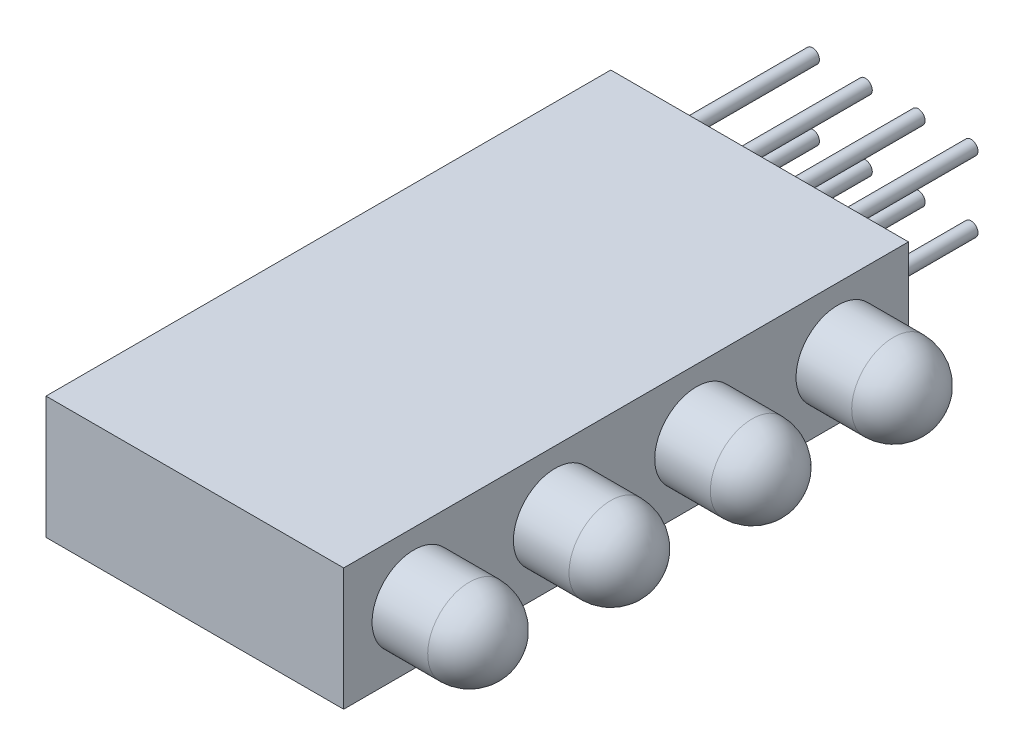
ISO-10303-21;
HEADER;
FILE_DESCRIPTION(('STEP AP214'),'2;1');
FILE_NAME('part.step','',(''),(''),'','','');
FILE_SCHEMA(('AUTOMOTIVE_DESIGN { 1 0 10303 214 1 1 1 1 }'));
ENDSEC;
DATA;
#1=APPLICATION_CONTEXT('core data for automotive mechanical design processes');
#2=APPLICATION_PROTOCOL_DEFINITION('international standard','automotive_design',2000,#1);
#3=PRODUCT_CONTEXT('',#1,'mechanical');
#4=PRODUCT('Part','Part','',(#3));
#5=PRODUCT_RELATED_PRODUCT_CATEGORY('part','',(#4));
#6=PRODUCT_DEFINITION_FORMATION('','',#4);
#7=PRODUCT_DEFINITION_CONTEXT('part definition',#1,'design');
#8=PRODUCT_DEFINITION('design','',#6,#7);
#9=PRODUCT_DEFINITION_SHAPE('','',#8);
#10=(LENGTH_UNIT() NAMED_UNIT(*) SI_UNIT(.MILLI.,.METRE.));
#11=(NAMED_UNIT(*) PLANE_ANGLE_UNIT() SI_UNIT($,.RADIAN.));
#12=(NAMED_UNIT(*) SI_UNIT($,.STERADIAN.) SOLID_ANGLE_UNIT());
#13=UNCERTAINTY_MEASURE_WITH_UNIT(LENGTH_MEASURE(1.E-05),#10,'distance_accuracy_value','');
#14=(GEOMETRIC_REPRESENTATION_CONTEXT(3) GLOBAL_UNCERTAINTY_ASSIGNED_CONTEXT((#13)) GLOBAL_UNIT_ASSIGNED_CONTEXT((#10,
#11,#12)) REPRESENTATION_CONTEXT('',''));
#15=CARTESIAN_POINT('',(0.,0.,0.));
#16=DIRECTION('',(0.,0.,1.));
#17=DIRECTION('',(1.,0.,0.));
#18=AXIS2_PLACEMENT_3D('',#15,#16,#17);
#19=CARTESIAN_POINT('',(5.35,2.2,20.3));
#20=DIRECTION('',(-1.,0.,0.));
#21=DIRECTION('',(0.,-1.,0.));
#22=AXIS2_PLACEMENT_3D('',#19,#20,#21);
#23=PLANE('',#22);
#24=CARTESIAN_POINT('',(5.35,0.,12.7));
#25=DIRECTION('',(-1.,0.,0.));
#26=DIRECTION('',(0.,-1.,0.));
#27=AXIS2_PLACEMENT_3D('',#24,#25,#26);
#28=CIRCLE('',#27,1.5);
#29=CARTESIAN_POINT('',(5.35,-1.50000000000007,12.7));
#30=VERTEX_POINT('',#29);
#31=EDGE_CURVE('E143',#30,#30,#28,.F.);
#32=ORIENTED_EDGE('',*,*,#31,.F.);
#33=EDGE_LOOP('',(#32));
#34=FACE_BOUND('',#33,.T.);
#35=CARTESIAN_POINT('',(5.35,0.,2.54));
#36=DIRECTION('',(-1.,0.,0.));
#37=DIRECTION('',(0.,-1.,0.));
#38=AXIS2_PLACEMENT_3D('',#35,#36,#37);
#39=CIRCLE('',#38,1.5);
#40=CARTESIAN_POINT('',(5.35,-1.5,2.54));
#41=VERTEX_POINT('',#40);
#42=EDGE_CURVE('E137',#41,#41,#39,.F.);
#43=ORIENTED_EDGE('',*,*,#42,.F.);
#44=EDGE_LOOP('',(#43));
#45=FACE_BOUND('',#44,.T.);
#46=DIRECTION('',(0.,1.,0.));
#47=VECTOR('',#46,1.);
#48=CARTESIAN_POINT('',(5.35,2.2,0.));
#49=LINE('',#48,#47);
#50=CARTESIAN_POINT('',(5.35,-2.2,0.));
#51=VERTEX_POINT('',#50);
#52=CARTESIAN_POINT('',(5.35,2.2,0.));
#53=VERTEX_POINT('',#52);
#54=EDGE_CURVE('E69',#51,#53,#49,.T.);
#55=ORIENTED_EDGE('',*,*,#54,.T.);
#56=DIRECTION('',(0.,0.,-1.));
#57=VECTOR('',#56,1.);
#58=CARTESIAN_POINT('',(5.35,2.2,20.3));
#59=LINE('',#58,#57);
#60=CARTESIAN_POINT('',(5.35,2.2,20.3));
#61=VERTEX_POINT('',#60);
#62=EDGE_CURVE('E95',#61,#53,#59,.T.);
#63=ORIENTED_EDGE('',*,*,#62,.F.);
#64=DIRECTION('',(0.,1.,0.));
#65=VECTOR('',#64,1.);
#66=CARTESIAN_POINT('',(5.35,2.2,20.3));
#67=LINE('',#66,#65);
#68=CARTESIAN_POINT('',(5.35,-2.2,20.3));
#69=VERTEX_POINT('',#68);
#70=EDGE_CURVE('E86',#69,#61,#67,.T.);
#71=ORIENTED_EDGE('',*,*,#70,.F.);
#72=DIRECTION('',(0.,0.,-1.));
#73=VECTOR('',#72,1.);
#74=CARTESIAN_POINT('',(5.35,-2.2,20.3));
#75=LINE('',#74,#73);
#76=EDGE_CURVE('E91',#69,#51,#75,.T.);
#77=ORIENTED_EDGE('',*,*,#76,.T.);
#78=EDGE_LOOP('',(#55,#63,#71,#77));
#79=FACE_BOUND('',#78,.T.);
#80=CARTESIAN_POINT('',(5.35,0.,7.62));
#81=DIRECTION('',(-1.,0.,0.));
#82=DIRECTION('',(0.,-1.,0.));
#83=AXIS2_PLACEMENT_3D('',#80,#81,#82);
#84=CIRCLE('',#83,1.5);
#85=CARTESIAN_POINT('',(5.35,-1.50000000000004,7.62));
#86=VERTEX_POINT('',#85);
#87=EDGE_CURVE('E140',#86,#86,#84,.F.);
#88=ORIENTED_EDGE('',*,*,#87,.F.);
#89=EDGE_LOOP('',(#88));
#90=FACE_BOUND('',#89,.T.);
#91=CARTESIAN_POINT('',(5.35,-1.08413626077967E-13,17.78));
#92=DIRECTION('',(-1.,0.,0.));
#93=DIRECTION('',(0.,-1.,0.));
#94=AXIS2_PLACEMENT_3D('',#91,#92,#93);
#95=CIRCLE('',#94,1.5);
#96=CARTESIAN_POINT('',(5.35,-1.50000000000011,17.78));
#97=VERTEX_POINT('',#96);
#98=EDGE_CURVE('E146',#97,#97,#95,.F.);
#99=ORIENTED_EDGE('',*,*,#98,.F.);
#100=EDGE_LOOP('',(#99));
#101=FACE_BOUND('',#100,.T.);
#102=ADVANCED_FACE('F35',(#34,#45,#79,#90,#101),#23,.F.);
#103=CARTESIAN_POINT('',(0.,0.,0.));
#104=DIRECTION('',(0.,0.,1.));
#105=DIRECTION('',(1.,0.,0.));
#106=AXIS2_PLACEMENT_3D('',#103,#104,#105);
#107=PLANE('',#106);
#108=CARTESIAN_POINT('',(0.699999999999999,-1.27,0.));
#109=DIRECTION('',(0.,0.,1.));
#110=DIRECTION('',(1.,0.,0.));
#111=AXIS2_PLACEMENT_3D('',#108,#109,#110);
#112=CIRCLE('',#111,0.25);
#113=CARTESIAN_POINT('',(0.95,-1.27,0.));
#114=VERTEX_POINT('',#113);
#115=EDGE_CURVE('E131',#114,#114,#112,.F.);
#116=ORIENTED_EDGE('',*,*,#115,.F.);
#117=EDGE_LOOP('',(#116));
#118=FACE_BOUND('',#117,.T.);
#119=CARTESIAN_POINT('',(-3.1,-1.27,0.));
#120=DIRECTION('',(0.,0.,1.));
#121=DIRECTION('',(1.,0.,0.));
#122=AXIS2_PLACEMENT_3D('',#119,#120,#121);
#123=CIRCLE('',#122,0.25);
#124=CARTESIAN_POINT('',(-2.85,-1.27,0.));
#125=VERTEX_POINT('',#124);
#126=EDGE_CURVE('E125',#125,#125,#123,.F.);
#127=ORIENTED_EDGE('',*,*,#126,.F.);
#128=EDGE_LOOP('',(#127));
#129=FACE_BOUND('',#128,.T.);
#130=CARTESIAN_POINT('',(-1.2,1.27,0.));
#131=DIRECTION('',(0.,0.,1.));
#132=DIRECTION('',(1.,0.,0.));
#133=AXIS2_PLACEMENT_3D('',#130,#131,#132);
#134=CIRCLE('',#133,0.25);
#135=CARTESIAN_POINT('',(-0.950000000000001,1.27,0.));
#136=VERTEX_POINT('',#135);
#137=EDGE_CURVE('E119',#136,#136,#134,.F.);
#138=ORIENTED_EDGE('',*,*,#137,.F.);
#139=EDGE_LOOP('',(#138));
#140=FACE_BOUND('',#139,.T.);
#141=CARTESIAN_POINT('',(2.6,1.27,0.));
#142=DIRECTION('',(0.,0.,1.));
#143=DIRECTION('',(1.,0.,0.));
#144=AXIS2_PLACEMENT_3D('',#141,#142,#143);
#145=CIRCLE('',#144,0.25);
#146=CARTESIAN_POINT('',(2.85,1.27,0.));
#147=VERTEX_POINT('',#146);
#148=EDGE_CURVE('E113',#147,#147,#145,.F.);
#149=ORIENTED_EDGE('',*,*,#148,.F.);
#150=EDGE_LOOP('',(#149));
#151=FACE_BOUND('',#150,.T.);
#152=DIRECTION('',(0.,-1.,0.));
#153=VECTOR('',#152,1.);
#154=CARTESIAN_POINT('',(-5.35,2.2,0.));
#155=LINE('',#154,#153);
#156=CARTESIAN_POINT('',(-5.35,2.2,0.));
#157=VERTEX_POINT('',#156);
#158=CARTESIAN_POINT('',(-5.35,-2.2,0.));
#159=VERTEX_POINT('',#158);
#160=EDGE_CURVE('E103',#157,#159,#155,.T.);
#161=ORIENTED_EDGE('',*,*,#160,.F.);
#162=DIRECTION('',(-1.,0.,0.));
#163=VECTOR('',#162,1.);
#164=CARTESIAN_POINT('',(-5.35,2.2,0.));
#165=LINE('',#164,#163);
#166=EDGE_CURVE('E75',#53,#157,#165,.T.);
#167=ORIENTED_EDGE('',*,*,#166,.F.);
#168=ORIENTED_EDGE('',*,*,#54,.F.);
#169=DIRECTION('',(1.,0.,0.));
#170=VECTOR('',#169,1.);
#171=CARTESIAN_POINT('',(-5.35,-2.2,0.));
#172=LINE('',#171,#170);
#173=EDGE_CURVE('E93',#159,#51,#172,.T.);
#174=ORIENTED_EDGE('',*,*,#173,.F.);
#175=EDGE_LOOP('',(#161,#167,#168,#174));
#176=FACE_BOUND('',#175,.T.);
#177=CARTESIAN_POINT('',(0.699999999999999,1.27,0.));
#178=DIRECTION('',(0.,0.,1.));
#179=DIRECTION('',(1.,0.,0.));
#180=AXIS2_PLACEMENT_3D('',#177,#178,#179);
#181=CIRCLE('',#180,0.25);
#182=CARTESIAN_POINT('',(0.95,1.27,0.));
#183=VERTEX_POINT('',#182);
#184=EDGE_CURVE('E116',#183,#183,#181,.F.);
#185=ORIENTED_EDGE('',*,*,#184,.F.);
#186=EDGE_LOOP('',(#185));
#187=FACE_BOUND('',#186,.T.);
#188=CARTESIAN_POINT('',(-3.1,1.27,0.));
#189=DIRECTION('',(0.,0.,1.));
#190=DIRECTION('',(1.,0.,0.));
#191=AXIS2_PLACEMENT_3D('',#188,#189,#190);
#192=CIRCLE('',#191,0.25);
#193=CARTESIAN_POINT('',(-2.85,1.27,0.));
#194=VERTEX_POINT('',#193);
#195=EDGE_CURVE('E122',#194,#194,#192,.F.);
#196=ORIENTED_EDGE('',*,*,#195,.F.);
#197=EDGE_LOOP('',(#196));
#198=FACE_BOUND('',#197,.T.);
#199=CARTESIAN_POINT('',(-1.2,-1.27,0.));
#200=DIRECTION('',(0.,0.,1.));
#201=DIRECTION('',(1.,0.,0.));
#202=AXIS2_PLACEMENT_3D('',#199,#200,#201);
#203=CIRCLE('',#202,0.25);
#204=CARTESIAN_POINT('',(-0.950000000000001,-1.27,0.));
#205=VERTEX_POINT('',#204);
#206=EDGE_CURVE('E128',#205,#205,#203,.F.);
#207=ORIENTED_EDGE('',*,*,#206,.F.);
#208=EDGE_LOOP('',(#207));
#209=FACE_BOUND('',#208,.T.);
#210=CARTESIAN_POINT('',(2.6,-1.27,0.));
#211=DIRECTION('',(0.,0.,1.));
#212=DIRECTION('',(1.,0.,0.));
#213=AXIS2_PLACEMENT_3D('',#210,#211,#212);
#214=CIRCLE('',#213,0.25);
#215=CARTESIAN_POINT('',(2.85,-1.27,0.));
#216=VERTEX_POINT('',#215);
#217=EDGE_CURVE('E134',#216,#216,#214,.F.);
#218=ORIENTED_EDGE('',*,*,#217,.F.);
#219=EDGE_LOOP('',(#218));
#220=FACE_BOUND('',#219,.T.);
#221=ADVANCED_FACE('F172',(#118,#129,#140,#151,#176,#187,#198,#209,#220),#107,.F.);
#222=CARTESIAN_POINT('',(-5.35,2.2,20.3));
#223=DIRECTION('',(1.,0.,0.));
#224=DIRECTION('',(0.,1.,0.));
#225=AXIS2_PLACEMENT_3D('',#222,#223,#224);
#226=PLANE('',#225);
#227=ORIENTED_EDGE('',*,*,#160,.T.);
#228=DIRECTION('',(0.,0.,-1.));
#229=VECTOR('',#228,1.);
#230=CARTESIAN_POINT('',(-5.35,-2.2,20.3));
#231=LINE('',#230,#229);
#232=CARTESIAN_POINT('',(-5.35,-2.2,20.3));
#233=VERTEX_POINT('',#232);
#234=EDGE_CURVE('E94',#233,#159,#231,.T.);
#235=ORIENTED_EDGE('',*,*,#234,.F.);
#236=DIRECTION('',(0.,-1.,0.));
#237=VECTOR('',#236,1.);
#238=CARTESIAN_POINT('',(-5.35,2.2,20.3));
#239=LINE('',#238,#237);
#240=CARTESIAN_POINT('',(-5.35,2.2,20.3));
#241=VERTEX_POINT('',#240);
#242=EDGE_CURVE('E88',#241,#233,#239,.T.);
#243=ORIENTED_EDGE('',*,*,#242,.F.);
#244=DIRECTION('',(0.,0.,-1.));
#245=VECTOR('',#244,1.);
#246=CARTESIAN_POINT('',(-5.35,2.2,20.3));
#247=LINE('',#246,#245);
#248=EDGE_CURVE('E99',#241,#157,#247,.T.);
#249=ORIENTED_EDGE('',*,*,#248,.T.);
#250=EDGE_LOOP('',(#227,#235,#243,#249));
#251=FACE_BOUND('',#250,.T.);
#252=ADVANCED_FACE('F178',(#251),#226,.F.);
#253=CARTESIAN_POINT('',(-5.35,-2.2,20.3));
#254=DIRECTION('',(0.,1.,0.));
#255=DIRECTION('',(0.,0.,1.));
#256=AXIS2_PLACEMENT_3D('',#253,#254,#255);
#257=PLANE('',#256);
#258=ORIENTED_EDGE('',*,*,#173,.T.);
#259=ORIENTED_EDGE('',*,*,#76,.F.);
#260=DIRECTION('',(1.,0.,0.));
#261=VECTOR('',#260,1.);
#262=CARTESIAN_POINT('',(-5.35,-2.2,20.3));
#263=LINE('',#262,#261);
#264=EDGE_CURVE('E83',#233,#69,#263,.T.);
#265=ORIENTED_EDGE('',*,*,#264,.F.);
#266=ORIENTED_EDGE('',*,*,#234,.T.);
#267=EDGE_LOOP('',(#258,#259,#265,#266));
#268=FACE_BOUND('',#267,.T.);
#269=ADVANCED_FACE('F92',(#268),#257,.F.);
#270=CARTESIAN_POINT('',(-5.35,2.2,20.3));
#271=DIRECTION('',(0.,-1.,0.));
#272=DIRECTION('',(1.,0.,0.));
#273=AXIS2_PLACEMENT_3D('',#270,#271,#272);
#274=PLANE('',#273);
#275=ORIENTED_EDGE('',*,*,#166,.T.);
#276=ORIENTED_EDGE('',*,*,#248,.F.);
#277=DIRECTION('',(-1.,0.,0.));
#278=VECTOR('',#277,1.);
#279=CARTESIAN_POINT('',(-5.35,2.2,20.3));
#280=LINE('',#279,#278);
#281=EDGE_CURVE('E52',#61,#241,#280,.T.);
#282=ORIENTED_EDGE('',*,*,#281,.F.);
#283=ORIENTED_EDGE('',*,*,#62,.T.);
#284=EDGE_LOOP('',(#275,#276,#282,#283));
#285=FACE_BOUND('',#284,.T.);
#286=ADVANCED_FACE('F185',(#285),#274,.F.);
#287=CARTESIAN_POINT('',(0.,0.,20.3));
#288=DIRECTION('',(0.,0.,1.));
#289=DIRECTION('',(1.,0.,0.));
#290=AXIS2_PLACEMENT_3D('',#287,#288,#289);
#291=PLANE('',#290);
#292=ORIENTED_EDGE('',*,*,#242,.T.);
#293=ORIENTED_EDGE('',*,*,#264,.T.);
#294=ORIENTED_EDGE('',*,*,#70,.T.);
#295=ORIENTED_EDGE('',*,*,#281,.T.);
#296=EDGE_LOOP('',(#292,#293,#294,#295));
#297=FACE_BOUND('',#296,.T.);
#298=ADVANCED_FACE('F84',(#297),#291,.T.);
#299=CARTESIAN_POINT('',(2.6,1.27,-5.));
#300=DIRECTION('',(0.,0.,1.));
#301=DIRECTION('',(1.,0.,0.));
#302=AXIS2_PLACEMENT_3D('',#299,#300,#301);
#303=CYLINDRICAL_SURFACE('',#302,0.25);
#304=CARTESIAN_POINT('',(2.6,1.27,-5.));
#305=DIRECTION('',(0.,0.,-1.));
#306=DIRECTION('',(-1.,0.,0.));
#307=AXIS2_PLACEMENT_3D('',#304,#305,#306);
#308=CIRCLE('',#307,0.25);
#309=CARTESIAN_POINT('',(2.35,1.27,-5.));
#310=VERTEX_POINT('',#309);
#311=EDGE_CURVE('E106',#310,#310,#308,.T.);
#312=ORIENTED_EDGE('',*,*,#311,.F.);
#313=EDGE_LOOP('',(#312));
#314=FACE_BOUND('',#313,.T.);
#315=ORIENTED_EDGE('',*,*,#148,.T.);
#316=EDGE_LOOP('',(#315));
#317=FACE_BOUND('',#316,.T.);
#318=ADVANCED_FACE('F273',(#314,#317),#303,.T.);
#319=CARTESIAN_POINT('',(2.6,1.27,-5.));
#320=DIRECTION('',(0.,0.,-1.));
#321=DIRECTION('',(-1.,0.,0.));
#322=AXIS2_PLACEMENT_3D('',#319,#320,#321);
#323=PLANE('',#322);
#324=ORIENTED_EDGE('',*,*,#311,.T.);
#325=EDGE_LOOP('',(#324));
#326=FACE_BOUND('',#325,.T.);
#327=ADVANCED_FACE('F269',(#326),#323,.T.);
#328=CARTESIAN_POINT('',(0.699999999999999,1.27,-5.));
#329=DIRECTION('',(0.,0.,1.));
#330=DIRECTION('',(1.,0.,0.));
#331=AXIS2_PLACEMENT_3D('',#328,#329,#330);
#332=CYLINDRICAL_SURFACE('',#331,0.25);
#333=CARTESIAN_POINT('',(0.699999999999999,1.27,-5.));
#334=DIRECTION('',(0.,0.,-1.));
#335=DIRECTION('',(-1.,0.,0.));
#336=AXIS2_PLACEMENT_3D('',#333,#334,#335);
#337=CIRCLE('',#336,0.25);
#338=CARTESIAN_POINT('',(0.449999999999999,1.27,-5.));
#339=VERTEX_POINT('',#338);
#340=EDGE_CURVE('E474',#339,#339,#337,.T.);
#341=ORIENTED_EDGE('',*,*,#340,.F.);
#342=EDGE_LOOP('',(#341));
#343=FACE_BOUND('',#342,.T.);
#344=ORIENTED_EDGE('',*,*,#184,.T.);
#345=EDGE_LOOP('',(#344));
#346=FACE_BOUND('',#345,.T.);
#347=ADVANCED_FACE('F265',(#343,#346),#332,.T.);
#348=CARTESIAN_POINT('',(0.699999999999999,1.27,-5.));
#349=DIRECTION('',(0.,0.,-1.));
#350=DIRECTION('',(-1.,0.,0.));
#351=AXIS2_PLACEMENT_3D('',#348,#349,#350);
#352=PLANE('',#351);
#353=ORIENTED_EDGE('',*,*,#340,.T.);
#354=EDGE_LOOP('',(#353));
#355=FACE_BOUND('',#354,.T.);
#356=ADVANCED_FACE('F261',(#355),#352,.T.);
#357=CARTESIAN_POINT('',(-1.2,1.27,-5.));
#358=DIRECTION('',(0.,0.,1.));
#359=DIRECTION('',(1.,0.,0.));
#360=AXIS2_PLACEMENT_3D('',#357,#358,#359);
#361=CYLINDRICAL_SURFACE('',#360,0.25);
#362=CARTESIAN_POINT('',(-1.2,1.27,-5.));
#363=DIRECTION('',(0.,0.,-1.));
#364=DIRECTION('',(-1.,0.,0.));
#365=AXIS2_PLACEMENT_3D('',#362,#363,#364);
#366=CIRCLE('',#365,0.25);
#367=CARTESIAN_POINT('',(-1.45,1.27,-5.));
#368=VERTEX_POINT('',#367);
#369=EDGE_CURVE('E477',#368,#368,#366,.T.);
#370=ORIENTED_EDGE('',*,*,#369,.F.);
#371=EDGE_LOOP('',(#370));
#372=FACE_BOUND('',#371,.T.);
#373=ORIENTED_EDGE('',*,*,#137,.T.);
#374=EDGE_LOOP('',(#373));
#375=FACE_BOUND('',#374,.T.);
#376=ADVANCED_FACE('F257',(#372,#375),#361,.T.);
#377=CARTESIAN_POINT('',(-1.2,1.27,-5.));
#378=DIRECTION('',(0.,0.,-1.));
#379=DIRECTION('',(-1.,0.,0.));
#380=AXIS2_PLACEMENT_3D('',#377,#378,#379);
#381=PLANE('',#380);
#382=ORIENTED_EDGE('',*,*,#369,.T.);
#383=EDGE_LOOP('',(#382));
#384=FACE_BOUND('',#383,.T.);
#385=ADVANCED_FACE('F253',(#384),#381,.T.);
#386=CARTESIAN_POINT('',(-3.1,1.27,-5.));
#387=DIRECTION('',(0.,0.,1.));
#388=DIRECTION('',(1.,0.,0.));
#389=AXIS2_PLACEMENT_3D('',#386,#387,#388);
#390=CYLINDRICAL_SURFACE('',#389,0.25);
#391=CARTESIAN_POINT('',(-3.1,1.27,-5.));
#392=DIRECTION('',(0.,0.,-1.));
#393=DIRECTION('',(-1.,0.,0.));
#394=AXIS2_PLACEMENT_3D('',#391,#392,#393);
#395=CIRCLE('',#394,0.25);
#396=CARTESIAN_POINT('',(-3.35,1.27,-5.));
#397=VERTEX_POINT('',#396);
#398=EDGE_CURVE('E480',#397,#397,#395,.T.);
#399=ORIENTED_EDGE('',*,*,#398,.F.);
#400=EDGE_LOOP('',(#399));
#401=FACE_BOUND('',#400,.T.);
#402=ORIENTED_EDGE('',*,*,#195,.T.);
#403=EDGE_LOOP('',(#402));
#404=FACE_BOUND('',#403,.T.);
#405=ADVANCED_FACE('F249',(#401,#404),#390,.T.);
#406=CARTESIAN_POINT('',(-3.1,1.27,-5.));
#407=DIRECTION('',(0.,0.,-1.));
#408=DIRECTION('',(-1.,0.,0.));
#409=AXIS2_PLACEMENT_3D('',#406,#407,#408);
#410=PLANE('',#409);
#411=ORIENTED_EDGE('',*,*,#398,.T.);
#412=EDGE_LOOP('',(#411));
#413=FACE_BOUND('',#412,.T.);
#414=ADVANCED_FACE('F245',(#413),#410,.T.);
#415=CARTESIAN_POINT('',(-3.1,-1.27,-5.));
#416=DIRECTION('',(0.,0.,1.));
#417=DIRECTION('',(1.,0.,0.));
#418=AXIS2_PLACEMENT_3D('',#415,#416,#417);
#419=CYLINDRICAL_SURFACE('',#418,0.25);
#420=CARTESIAN_POINT('',(-3.1,-1.27,-5.));
#421=DIRECTION('',(0.,0.,-1.));
#422=DIRECTION('',(1.,0.,0.));
#423=AXIS2_PLACEMENT_3D('',#420,#421,#422);
#424=CIRCLE('',#423,0.25);
#425=CARTESIAN_POINT('',(-2.85,-1.27,-5.));
#426=VERTEX_POINT('',#425);
#427=EDGE_CURVE('E483',#426,#426,#424,.T.);
#428=ORIENTED_EDGE('',*,*,#427,.F.);
#429=EDGE_LOOP('',(#428));
#430=FACE_BOUND('',#429,.T.);
#431=ORIENTED_EDGE('',*,*,#126,.T.);
#432=EDGE_LOOP('',(#431));
#433=FACE_BOUND('',#432,.T.);
#434=ADVANCED_FACE('F241',(#430,#433),#419,.T.);
#435=CARTESIAN_POINT('',(-3.1,-1.27,-5.));
#436=DIRECTION('',(0.,0.,1.));
#437=DIRECTION('',(1.,0.,0.));
#438=AXIS2_PLACEMENT_3D('',#435,#436,#437);
#439=PLANE('',#438);
#440=ORIENTED_EDGE('',*,*,#427,.T.);
#441=EDGE_LOOP('',(#440));
#442=FACE_BOUND('',#441,.T.);
#443=ADVANCED_FACE('F237',(#442),#439,.F.);
#444=CARTESIAN_POINT('',(-1.2,-1.27,-5.));
#445=DIRECTION('',(0.,0.,1.));
#446=DIRECTION('',(1.,0.,0.));
#447=AXIS2_PLACEMENT_3D('',#444,#445,#446);
#448=CYLINDRICAL_SURFACE('',#447,0.25);
#449=CARTESIAN_POINT('',(-1.2,-1.27,-5.));
#450=DIRECTION('',(0.,0.,-1.));
#451=DIRECTION('',(1.,0.,0.));
#452=AXIS2_PLACEMENT_3D('',#449,#450,#451);
#453=CIRCLE('',#452,0.25);
#454=CARTESIAN_POINT('',(-0.950000000000001,-1.27,-5.));
#455=VERTEX_POINT('',#454);
#456=EDGE_CURVE('E486',#455,#455,#453,.T.);
#457=ORIENTED_EDGE('',*,*,#456,.F.);
#458=EDGE_LOOP('',(#457));
#459=FACE_BOUND('',#458,.T.);
#460=ORIENTED_EDGE('',*,*,#206,.T.);
#461=EDGE_LOOP('',(#460));
#462=FACE_BOUND('',#461,.T.);
#463=ADVANCED_FACE('F233',(#459,#462),#448,.T.);
#464=CARTESIAN_POINT('',(-1.2,-1.27,-5.));
#465=DIRECTION('',(0.,0.,1.));
#466=DIRECTION('',(1.,0.,0.));
#467=AXIS2_PLACEMENT_3D('',#464,#465,#466);
#468=PLANE('',#467);
#469=ORIENTED_EDGE('',*,*,#456,.T.);
#470=EDGE_LOOP('',(#469));
#471=FACE_BOUND('',#470,.T.);
#472=ADVANCED_FACE('F229',(#471),#468,.F.);
#473=CARTESIAN_POINT('',(0.699999999999999,-1.27,-5.));
#474=DIRECTION('',(0.,0.,1.));
#475=DIRECTION('',(1.,0.,0.));
#476=AXIS2_PLACEMENT_3D('',#473,#474,#475);
#477=CYLINDRICAL_SURFACE('',#476,0.25);
#478=CARTESIAN_POINT('',(0.699999999999999,-1.27,-5.));
#479=DIRECTION('',(0.,0.,-1.));
#480=DIRECTION('',(1.,0.,0.));
#481=AXIS2_PLACEMENT_3D('',#478,#479,#480);
#482=CIRCLE('',#481,0.25);
#483=CARTESIAN_POINT('',(0.95,-1.27,-5.));
#484=VERTEX_POINT('',#483);
#485=EDGE_CURVE('E489',#484,#484,#482,.T.);
#486=ORIENTED_EDGE('',*,*,#485,.F.);
#487=EDGE_LOOP('',(#486));
#488=FACE_BOUND('',#487,.T.);
#489=ORIENTED_EDGE('',*,*,#115,.T.);
#490=EDGE_LOOP('',(#489));
#491=FACE_BOUND('',#490,.T.);
#492=ADVANCED_FACE('F225',(#488,#491),#477,.T.);
#493=CARTESIAN_POINT('',(0.699999999999999,-1.27,-5.));
#494=DIRECTION('',(0.,0.,1.));
#495=DIRECTION('',(1.,0.,0.));
#496=AXIS2_PLACEMENT_3D('',#493,#494,#495);
#497=PLANE('',#496);
#498=ORIENTED_EDGE('',*,*,#485,.T.);
#499=EDGE_LOOP('',(#498));
#500=FACE_BOUND('',#499,.T.);
#501=ADVANCED_FACE('F221',(#500),#497,.F.);
#502=CARTESIAN_POINT('',(2.6,-1.27,-5.));
#503=DIRECTION('',(0.,0.,1.));
#504=DIRECTION('',(1.,0.,0.));
#505=AXIS2_PLACEMENT_3D('',#502,#503,#504);
#506=CYLINDRICAL_SURFACE('',#505,0.25);
#507=CARTESIAN_POINT('',(2.6,-1.27,-5.));
#508=DIRECTION('',(0.,0.,-1.));
#509=DIRECTION('',(1.,0.,0.));
#510=AXIS2_PLACEMENT_3D('',#507,#508,#509);
#511=CIRCLE('',#510,0.25);
#512=CARTESIAN_POINT('',(2.85,-1.27,-5.));
#513=VERTEX_POINT('',#512);
#514=EDGE_CURVE('E492',#513,#513,#511,.T.);
#515=ORIENTED_EDGE('',*,*,#514,.F.);
#516=EDGE_LOOP('',(#515));
#517=FACE_BOUND('',#516,.T.);
#518=ORIENTED_EDGE('',*,*,#217,.T.);
#519=EDGE_LOOP('',(#518));
#520=FACE_BOUND('',#519,.T.);
#521=ADVANCED_FACE('F214',(#517,#520),#506,.T.);
#522=CARTESIAN_POINT('',(2.6,-1.27,-5.));
#523=DIRECTION('',(0.,0.,1.));
#524=DIRECTION('',(1.,0.,0.));
#525=AXIS2_PLACEMENT_3D('',#522,#523,#524);
#526=PLANE('',#525);
#527=ORIENTED_EDGE('',*,*,#514,.T.);
#528=EDGE_LOOP('',(#527));
#529=FACE_BOUND('',#528,.T.);
#530=ADVANCED_FACE('F205',(#529),#526,.F.);
#531=CARTESIAN_POINT('',(8.85,0.,2.54));
#532=DIRECTION('',(-1.,0.,0.));
#533=DIRECTION('',(0.,-1.,0.));
#534=AXIS2_PLACEMENT_3D('',#531,#532,#533);
#535=CYLINDRICAL_SURFACE('',#534,1.5);
#536=CARTESIAN_POINT('',(7.35,0.,2.54));
#537=DIRECTION('',(-1.,0.,0.));
#538=DIRECTION('',(0.,-1.,0.));
#539=AXIS2_PLACEMENT_3D('',#536,#537,#538);
#540=CIRCLE('',#539,1.5);
#541=CARTESIAN_POINT('',(7.35,-1.5,2.54));
#542=VERTEX_POINT('',#541);
#543=EDGE_CURVE('E149',#542,#542,#540,.T.);
#544=ORIENTED_EDGE('',*,*,#543,.T.);
#545=EDGE_LOOP('',(#544));
#546=FACE_BOUND('',#545,.T.);
#547=ORIENTED_EDGE('',*,*,#42,.T.);
#548=EDGE_LOOP('',(#547));
#549=FACE_BOUND('',#548,.T.);
#550=ADVANCED_FACE('F201',(#546,#549),#535,.T.);
#551=CARTESIAN_POINT('',(8.85,0.,7.62));
#552=DIRECTION('',(-1.,0.,0.));
#553=DIRECTION('',(0.,-1.,0.));
#554=AXIS2_PLACEMENT_3D('',#551,#552,#553);
#555=CYLINDRICAL_SURFACE('',#554,1.5);
#556=CARTESIAN_POINT('',(7.35,0.,7.62));
#557=DIRECTION('',(-1.,0.,0.));
#558=DIRECTION('',(0.,-1.,0.));
#559=AXIS2_PLACEMENT_3D('',#556,#557,#558);
#560=CIRCLE('',#559,1.5);
#561=CARTESIAN_POINT('',(7.35,-1.50000000000004,7.62));
#562=VERTEX_POINT('',#561);
#563=EDGE_CURVE('E152',#562,#562,#560,.T.);
#564=ORIENTED_EDGE('',*,*,#563,.T.);
#565=EDGE_LOOP('',(#564));
#566=FACE_BOUND('',#565,.T.);
#567=ORIENTED_EDGE('',*,*,#87,.T.);
#568=EDGE_LOOP('',(#567));
#569=FACE_BOUND('',#568,.T.);
#570=ADVANCED_FACE('F204',(#566,#569),#555,.T.);
#571=CARTESIAN_POINT('',(8.85,0.,12.7));
#572=DIRECTION('',(-1.,0.,0.));
#573=DIRECTION('',(0.,-1.,0.));
#574=AXIS2_PLACEMENT_3D('',#571,#572,#573);
#575=CYLINDRICAL_SURFACE('',#574,1.5);
#576=CARTESIAN_POINT('',(7.35,0.,12.7));
#577=DIRECTION('',(-1.,0.,0.));
#578=DIRECTION('',(0.,-1.,0.));
#579=AXIS2_PLACEMENT_3D('',#576,#577,#578);
#580=CIRCLE('',#579,1.5);
#581=CARTESIAN_POINT('',(7.35,-1.50000000000007,12.7));
#582=VERTEX_POINT('',#581);
#583=EDGE_CURVE('E44',#582,#582,#580,.T.);
#584=ORIENTED_EDGE('',*,*,#583,.T.);
#585=EDGE_LOOP('',(#584));
#586=FACE_BOUND('',#585,.T.);
#587=ORIENTED_EDGE('',*,*,#31,.T.);
#588=EDGE_LOOP('',(#587));
#589=FACE_BOUND('',#588,.T.);
#590=ADVANCED_FACE('F157',(#586,#589),#575,.T.);
#591=CARTESIAN_POINT('',(8.85,-1.09103572915004E-13,17.78));
#592=DIRECTION('',(-1.,0.,0.));
#593=DIRECTION('',(0.,-1.,0.));
#594=AXIS2_PLACEMENT_3D('',#591,#592,#593);
#595=CYLINDRICAL_SURFACE('',#594,1.5);
#596=CARTESIAN_POINT('',(7.35,-1.08807881413417E-13,17.78));
#597=DIRECTION('',(-1.,0.,0.));
#598=DIRECTION('',(0.,-1.,0.));
#599=AXIS2_PLACEMENT_3D('',#596,#597,#598);
#600=CIRCLE('',#599,1.5);
#601=CARTESIAN_POINT('',(7.35,-1.50000000000011,17.78));
#602=VERTEX_POINT('',#601);
#603=EDGE_CURVE('E11',#602,#602,#600,.T.);
#604=ORIENTED_EDGE('',*,*,#603,.T.);
#605=EDGE_LOOP('',(#604));
#606=FACE_BOUND('',#605,.T.);
#607=ORIENTED_EDGE('',*,*,#98,.T.);
#608=EDGE_LOOP('',(#607));
#609=FACE_BOUND('',#608,.T.);
#610=ADVANCED_FACE('F192',(#606,#609),#595,.T.);
#611=CARTESIAN_POINT('',(7.35,0.,2.54));
#612=DIRECTION('',(0.,0.,1.));
#613=DIRECTION('',(1.,0.,0.));
#614=AXIS2_PLACEMENT_3D('',#611,#612,#613);
#615=SPHERICAL_SURFACE('',#614,1.5);
#616=CARTESIAN_POINT('',(7.35,0.,2.54));
#617=DIRECTION('',(-1.,0.,0.));
#618=DIRECTION('',(0.,-1.,0.));
#619=AXIS2_PLACEMENT_3D('',#616,#617,#618);
#620=SPHERICAL_SURFACE('',#619,1.5);
#621=ORIENTED_EDGE('',*,*,#543,.F.);
#622=EDGE_LOOP('',(#621));
#623=FACE_BOUND('',#622,.T.);
#624=ADVANCED_FACE('F168',(#623),#620,.T.);
#625=CARTESIAN_POINT('',(7.35,0.,7.62));
#626=DIRECTION('',(0.,0.,1.));
#627=DIRECTION('',(1.,0.,0.));
#628=AXIS2_PLACEMENT_3D('',#625,#626,#627);
#629=SPHERICAL_SURFACE('',#628,1.5);
#630=CARTESIAN_POINT('',(7.35,0.,7.62));
#631=DIRECTION('',(-1.,0.,0.));
#632=DIRECTION('',(0.,-1.,0.));
#633=AXIS2_PLACEMENT_3D('',#630,#631,#632);
#634=SPHERICAL_SURFACE('',#633,1.5);
#635=ORIENTED_EDGE('',*,*,#563,.F.);
#636=EDGE_LOOP('',(#635));
#637=FACE_BOUND('',#636,.T.);
#638=ADVANCED_FACE('F162',(#637),#634,.T.);
#639=CARTESIAN_POINT('',(7.35,0.,12.7));
#640=DIRECTION('',(0.,0.,1.));
#641=DIRECTION('',(1.,0.,0.));
#642=AXIS2_PLACEMENT_3D('',#639,#640,#641);
#643=SPHERICAL_SURFACE('',#642,1.5);
#644=CARTESIAN_POINT('',(7.35,0.,12.7));
#645=DIRECTION('',(-1.,0.,0.));
#646=DIRECTION('',(0.,-1.,0.));
#647=AXIS2_PLACEMENT_3D('',#644,#645,#646);
#648=SPHERICAL_SURFACE('',#647,1.5);
#649=ORIENTED_EDGE('',*,*,#583,.F.);
#650=EDGE_LOOP('',(#649));
#651=FACE_BOUND('',#650,.T.);
#652=ADVANCED_FACE('F160',(#651),#648,.T.);
#653=CARTESIAN_POINT('',(7.35,-1.08807881413417E-13,17.78));
#654=DIRECTION('',(0.,0.,1.));
#655=DIRECTION('',(1.,0.,0.));
#656=AXIS2_PLACEMENT_3D('',#653,#654,#655);
#657=SPHERICAL_SURFACE('',#656,1.5);
#658=CARTESIAN_POINT('',(7.35,-1.08807881413417E-13,17.78));
#659=DIRECTION('',(-1.,0.,0.));
#660=DIRECTION('',(0.,-1.,0.));
#661=AXIS2_PLACEMENT_3D('',#658,#659,#660);
#662=SPHERICAL_SURFACE('',#661,1.5);
#663=ORIENTED_EDGE('',*,*,#603,.F.);
#664=EDGE_LOOP('',(#663));
#665=FACE_BOUND('',#664,.T.);
#666=ADVANCED_FACE('F37',(#665),#662,.T.);
#667=CLOSED_SHELL('',(#102,#221,#252,#269,#286,#298,#318,#327,#347,#356,#376,#385,#405,#414,
#434,#443,#463,#472,#492,#501,#521,#530,#550,#570,#590,#610,#624,#638,#652,#666));
#668=MANIFOLD_SOLID_BREP('B2',#667);
#669=ADVANCED_BREP_SHAPE_REPRESENTATION('',(#18,#668),#14);
#670=SHAPE_DEFINITION_REPRESENTATION(#9,#669);
ENDSEC;
END-ISO-10303-21;
